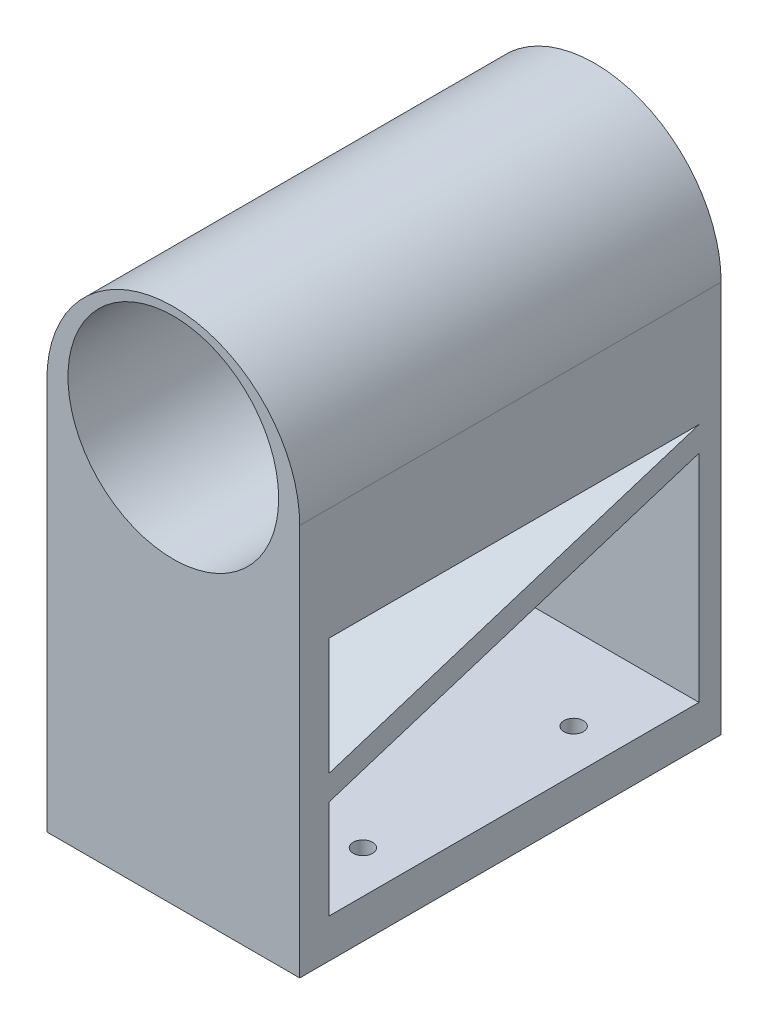
ISO-10303-21;
HEADER;
FILE_DESCRIPTION(('STEP AP214'),'2;1');
FILE_NAME('part.step','',(''),(''),'','','');
FILE_SCHEMA(('AUTOMOTIVE_DESIGN { 1 0 10303 214 1 1 1 1 }'));
ENDSEC;
DATA;
#1=APPLICATION_CONTEXT('core data for automotive mechanical design processes');
#2=APPLICATION_PROTOCOL_DEFINITION('international standard','automotive_design',2000,#1);
#3=PRODUCT_CONTEXT('',#1,'mechanical');
#4=PRODUCT('Part','Part','',(#3));
#5=PRODUCT_RELATED_PRODUCT_CATEGORY('part','',(#4));
#6=PRODUCT_DEFINITION_FORMATION('','',#4);
#7=PRODUCT_DEFINITION_CONTEXT('part definition',#1,'design');
#8=PRODUCT_DEFINITION('design','',#6,#7);
#9=PRODUCT_DEFINITION_SHAPE('','',#8);
#10=(LENGTH_UNIT() NAMED_UNIT(*) SI_UNIT(.MILLI.,.METRE.));
#11=(NAMED_UNIT(*) PLANE_ANGLE_UNIT() SI_UNIT($,.RADIAN.));
#12=(NAMED_UNIT(*) SI_UNIT($,.STERADIAN.) SOLID_ANGLE_UNIT());
#13=UNCERTAINTY_MEASURE_WITH_UNIT(LENGTH_MEASURE(1.E-05),#10,'distance_accuracy_value','');
#14=(GEOMETRIC_REPRESENTATION_CONTEXT(3) GLOBAL_UNCERTAINTY_ASSIGNED_CONTEXT((#13)) GLOBAL_UNIT_ASSIGNED_CONTEXT((#10,
#11,#12)) REPRESENTATION_CONTEXT('',''));
#15=CARTESIAN_POINT('',(0.,0.,0.));
#16=DIRECTION('',(0.,0.,1.));
#17=DIRECTION('',(1.,0.,0.));
#18=AXIS2_PLACEMENT_3D('',#15,#16,#17);
#19=CARTESIAN_POINT('',(-12.7,16.9848695652174,50.8));
#20=DIRECTION('',(1.,0.,0.));
#21=DIRECTION('',(0.,1.,0.));
#22=AXIS2_PLACEMENT_3D('',#19,#20,#21);
#23=PLANE('',#22);
#24=DIRECTION('',(0.,-0.30176042441697,0.953383787493626));
#25=VECTOR('',#24,1.);
#26=CARTESIAN_POINT('',(-12.7,-11.8783950754035,41.6643391021884));
#27=LINE('',#26,#25);
#28=CARTESIAN_POINT('',(-12.7,0.46563063998659,2.66454642826376));
#29=VERTEX_POINT('',#28);
#30=CARTESIAN_POINT('',(-12.7,-13.6454059569076,47.2470444221642));
#31=VERTEX_POINT('',#30);
#32=EDGE_CURVE('E198',#29,#31,#27,.T.);
#33=ORIENTED_EDGE('',*,*,#32,.T.);
#34=DIRECTION('',(0.,-1.,0.));
#35=VECTOR('',#34,1.);
#36=CARTESIAN_POINT('',(-12.7,16.9848695652174,47.2470444221642));
#37=LINE('',#36,#35);
#38=CARTESIAN_POINT('',(-12.7,-25.5538829775332,47.2470444221642));
#39=VERTEX_POINT('',#38);
#40=EDGE_CURVE('E202',#31,#39,#37,.T.);
#41=ORIENTED_EDGE('',*,*,#40,.T.);
#42=DIRECTION('',(0.,0.,-1.));
#43=VECTOR('',#42,1.);
#44=CARTESIAN_POINT('',(-12.7,-25.5538829775333,50.8));
#45=LINE('',#44,#43);
#46=CARTESIAN_POINT('',(-12.7,-25.5538829775333,2.66454642826376));
#47=VERTEX_POINT('',#46);
#48=EDGE_CURVE('E193',#39,#47,#45,.T.);
#49=ORIENTED_EDGE('',*,*,#48,.T.);
#50=DIRECTION('',(0.,1.,0.));
#51=VECTOR('',#50,1.);
#52=CARTESIAN_POINT('',(-12.7,16.9848695652174,2.66454642826376));
#53=LINE('',#52,#51);
#54=EDGE_CURVE('E129',#47,#29,#53,.T.);
#55=ORIENTED_EDGE('',*,*,#54,.T.);
#56=EDGE_LOOP('',(#33,#41,#49,#55));
#57=FACE_BOUND('',#56,.T.);
#58=DIRECTION('',(0.,0.,1.));
#59=VECTOR('',#58,1.);
#60=CARTESIAN_POINT('',(-12.7,3.45371440236873,50.8));
#61=LINE('',#60,#59);
#62=CARTESIAN_POINT('',(-12.7,3.45371440236873,2.66454642826376));
#63=VERTEX_POINT('',#62);
#64=CARTESIAN_POINT('',(-12.7,3.45371440236873,47.2470444221642));
#65=VERTEX_POINT('',#64);
#66=EDGE_CURVE('E185',#63,#65,#61,.T.);
#67=ORIENTED_EDGE('',*,*,#66,.T.);
#68=DIRECTION('',(0.,-1.,0.));
#69=VECTOR('',#68,1.);
#70=CARTESIAN_POINT('',(-12.7,16.9848695652174,47.2470444221642));
#71=LINE('',#70,#69);
#72=CARTESIAN_POINT('',(-12.7,-10.6573221945254,47.2470444221642));
#73=VERTEX_POINT('',#72);
#74=EDGE_CURVE('E189',#65,#73,#71,.T.);
#75=ORIENTED_EDGE('',*,*,#74,.T.);
#76=DIRECTION('',(0.,0.30176042441697,-0.953383787493626));
#77=VECTOR('',#76,1.);
#78=CARTESIAN_POINT('',(-12.7,-9.16240428935774,42.5239913671638));
#79=LINE('',#78,#77);
#80=EDGE_CURVE('E176',#73,#63,#79,.T.);
#81=ORIENTED_EDGE('',*,*,#80,.T.);
#82=EDGE_LOOP('',(#67,#75,#81));
#83=FACE_BOUND('',#82,.T.);
#84=DIRECTION('',(0.,-1.,0.));
#85=VECTOR('',#84,1.);
#86=CARTESIAN_POINT('',(-12.7,16.9848695652174,0.));
#87=LINE('',#86,#85);
#88=CARTESIAN_POINT('',(-12.7,16.9848695652174,0.));
#89=VERTEX_POINT('',#88);
#90=CARTESIAN_POINT('',(-12.7,-30.2591304347826,0.));
#91=VERTEX_POINT('',#90);
#92=EDGE_CURVE('E211',#89,#91,#87,.T.);
#93=ORIENTED_EDGE('',*,*,#92,.T.);
#94=DIRECTION('',(0.,0.,-1.));
#95=VECTOR('',#94,1.);
#96=CARTESIAN_POINT('',(-12.7,-30.2591304347826,50.8));
#97=LINE('',#96,#95);
#98=CARTESIAN_POINT('',(-12.7,-30.2591304347826,50.8));
#99=VERTEX_POINT('',#98);
#100=EDGE_CURVE('E11',#99,#91,#97,.T.);
#101=ORIENTED_EDGE('',*,*,#100,.F.);
#102=DIRECTION('',(0.,-1.,0.));
#103=VECTOR('',#102,1.);
#104=CARTESIAN_POINT('',(-12.7,16.9848695652174,50.8));
#105=LINE('',#104,#103);
#106=CARTESIAN_POINT('',(-12.7,16.9848695652174,50.8));
#107=VERTEX_POINT('',#106);
#108=EDGE_CURVE('E215',#107,#99,#105,.T.);
#109=ORIENTED_EDGE('',*,*,#108,.F.);
#110=DIRECTION('',(0.,0.,-1.));
#111=VECTOR('',#110,1.);
#112=CARTESIAN_POINT('',(-12.7,16.9848695652174,50.8));
#113=LINE('',#112,#111);
#114=EDGE_CURVE('E229',#107,#89,#113,.T.);
#115=ORIENTED_EDGE('',*,*,#114,.T.);
#116=EDGE_LOOP('',(#93,#101,#109,#115));
#117=FACE_BOUND('',#116,.T.);
#118=ADVANCED_FACE('F39',(#57,#83,#117),#23,.F.);
#119=CARTESIAN_POINT('',(17.78,-30.2591304347826,50.8));
#120=DIRECTION('',(0.,1.,0.));
#121=DIRECTION('',(0.,0.,1.));
#122=AXIS2_PLACEMENT_3D('',#119,#120,#121);
#123=PLANE('',#122);
#124=CARTESIAN_POINT('',(12.7,-30.2591304347826,12.7));
#125=DIRECTION('',(0.,-1.,0.));
#126=DIRECTION('',(0.,0.,-1.));
#127=AXIS2_PLACEMENT_3D('',#124,#125,#126);
#128=CIRCLE('',#127,1.16674744552587);
#129=CARTESIAN_POINT('',(12.7,-30.2591304347826,11.5332525544741));
#130=VERTEX_POINT('',#129);
#131=EDGE_CURVE('E275',#130,#130,#128,.T.);
#132=ORIENTED_EDGE('',*,*,#131,.F.);
#133=EDGE_LOOP('',(#132));
#134=FACE_BOUND('',#133,.T.);
#135=CARTESIAN_POINT('',(12.7,-30.2591304347826,38.1));
#136=DIRECTION('',(0.,-1.,0.));
#137=DIRECTION('',(0.,0.,-1.));
#138=AXIS2_PLACEMENT_3D('',#135,#136,#137);
#139=CIRCLE('',#138,1.16674744552587);
#140=CARTESIAN_POINT('',(12.7,-30.2591304347826,36.9332525544741));
#141=VERTEX_POINT('',#140);
#142=EDGE_CURVE('E279',#141,#141,#139,.T.);
#143=ORIENTED_EDGE('',*,*,#142,.F.);
#144=EDGE_LOOP('',(#143));
#145=FACE_BOUND('',#144,.T.);
#146=CARTESIAN_POINT('',(-7.62000000000001,-30.2591304347826,38.1));
#147=DIRECTION('',(0.,-1.,0.));
#148=DIRECTION('',(0.,0.,-1.));
#149=AXIS2_PLACEMENT_3D('',#146,#147,#148);
#150=CIRCLE('',#149,1.16674744552587);
#151=CARTESIAN_POINT('',(-7.62000000000001,-30.2591304347826,36.9332525544741));
#152=VERTEX_POINT('',#151);
#153=EDGE_CURVE('E274',#152,#152,#150,.T.);
#154=ORIENTED_EDGE('',*,*,#153,.F.);
#155=EDGE_LOOP('',(#154));
#156=FACE_BOUND('',#155,.T.);
#157=CARTESIAN_POINT('',(-7.62,-30.2591304347826,12.7));
#158=DIRECTION('',(0.,-1.,0.));
#159=DIRECTION('',(0.,0.,-1.));
#160=AXIS2_PLACEMENT_3D('',#157,#158,#159);
#161=CIRCLE('',#160,1.16674744552587);
#162=CARTESIAN_POINT('',(-7.62,-30.2591304347826,11.5332525544741));
#163=VERTEX_POINT('',#162);
#164=EDGE_CURVE('E256',#163,#163,#161,.T.);
#165=ORIENTED_EDGE('',*,*,#164,.F.);
#166=EDGE_LOOP('',(#165));
#167=FACE_BOUND('',#166,.T.);
#168=DIRECTION('',(1.,0.,0.));
#169=VECTOR('',#168,1.);
#170=CARTESIAN_POINT('',(17.78,-30.2591304347826,0.));
#171=LINE('',#170,#169);
#172=CARTESIAN_POINT('',(17.78,-30.2591304347826,0.));
#173=VERTEX_POINT('',#172);
#174=EDGE_CURVE('E233',#91,#173,#171,.T.);
#175=ORIENTED_EDGE('',*,*,#174,.T.);
#176=DIRECTION('',(0.,0.,-1.));
#177=VECTOR('',#176,1.);
#178=CARTESIAN_POINT('',(17.78,-30.2591304347826,50.8));
#179=LINE('',#178,#177);
#180=CARTESIAN_POINT('',(17.78,-30.2591304347826,50.8));
#181=VERTEX_POINT('',#180);
#182=EDGE_CURVE('E48',#181,#173,#179,.T.);
#183=ORIENTED_EDGE('',*,*,#182,.F.);
#184=DIRECTION('',(1.,0.,0.));
#185=VECTOR('',#184,1.);
#186=CARTESIAN_POINT('',(17.78,-30.2591304347826,50.8));
#187=LINE('',#186,#185);
#188=EDGE_CURVE('E219',#99,#181,#187,.T.);
#189=ORIENTED_EDGE('',*,*,#188,.F.);
#190=ORIENTED_EDGE('',*,*,#100,.T.);
#191=EDGE_LOOP('',(#175,#183,#189,#190));
#192=FACE_BOUND('',#191,.T.);
#193=ADVANCED_FACE('F290',(#134,#145,#156,#167,#192),#123,.F.);
#194=CARTESIAN_POINT('',(17.78,16.9848695652174,50.8));
#195=DIRECTION('',(-1.,0.,0.));
#196=DIRECTION('',(0.,-1.,0.));
#197=AXIS2_PLACEMENT_3D('',#194,#195,#196);
#198=PLANE('',#197);
#199=DIRECTION('',(0.,0.,-1.));
#200=VECTOR('',#199,1.);
#201=CARTESIAN_POINT('',(17.78,-25.5538829775332,2.66454642826376));
#202=LINE('',#201,#200);
#203=CARTESIAN_POINT('',(17.78,-25.5538829775332,47.2470444221642));
#204=VERTEX_POINT('',#203);
#205=CARTESIAN_POINT('',(17.78,-25.5538829775332,2.66454642826376));
#206=VERTEX_POINT('',#205);
#207=EDGE_CURVE('E137',#204,#206,#202,.T.);
#208=ORIENTED_EDGE('',*,*,#207,.F.);
#209=DIRECTION('',(0.,-1.,0.));
#210=VECTOR('',#209,1.);
#211=CARTESIAN_POINT('',(17.78,-25.5538829775332,47.2470444221642));
#212=LINE('',#211,#210);
#213=CARTESIAN_POINT('',(17.78,-13.6454059569075,47.2470444221642));
#214=VERTEX_POINT('',#213);
#215=EDGE_CURVE('E143',#214,#204,#212,.T.);
#216=ORIENTED_EDGE('',*,*,#215,.F.);
#217=DIRECTION('',(0.,-0.30176042441697,0.953383787493626));
#218=VECTOR('',#217,1.);
#219=CARTESIAN_POINT('',(17.78,-13.6454059569075,47.2470444221642));
#220=LINE('',#219,#218);
#221=CARTESIAN_POINT('',(17.78,0.465630639986594,2.66454642826376));
#222=VERTEX_POINT('',#221);
#223=EDGE_CURVE('E148',#222,#214,#220,.T.);
#224=ORIENTED_EDGE('',*,*,#223,.F.);
#225=DIRECTION('',(0.,1.,0.));
#226=VECTOR('',#225,1.);
#227=CARTESIAN_POINT('',(17.78,0.465630639986594,2.66454642826376));
#228=LINE('',#227,#226);
#229=EDGE_CURVE('E126',#206,#222,#228,.T.);
#230=ORIENTED_EDGE('',*,*,#229,.F.);
#231=EDGE_LOOP('',(#208,#216,#224,#230));
#232=FACE_BOUND('',#231,.T.);
#233=DIRECTION('',(0.,0.30176042441697,-0.953383787493626));
#234=VECTOR('',#233,1.);
#235=CARTESIAN_POINT('',(17.78,3.45371440236873,2.66454642826376));
#236=LINE('',#235,#234);
#237=CARTESIAN_POINT('',(17.78,-10.6573221945254,47.2470444221642));
#238=VERTEX_POINT('',#237);
#239=CARTESIAN_POINT('',(17.78,3.45371440236873,2.66454642826376));
#240=VERTEX_POINT('',#239);
#241=EDGE_CURVE('E165',#238,#240,#236,.T.);
#242=ORIENTED_EDGE('',*,*,#241,.F.);
#243=DIRECTION('',(0.,-1.,0.));
#244=VECTOR('',#243,1.);
#245=CARTESIAN_POINT('',(17.78,-10.6573221945254,47.2470444221642));
#246=LINE('',#245,#244);
#247=CARTESIAN_POINT('',(17.78,3.45371440236873,47.2470444221642));
#248=VERTEX_POINT('',#247);
#249=EDGE_CURVE('E158',#248,#238,#246,.T.);
#250=ORIENTED_EDGE('',*,*,#249,.F.);
#251=DIRECTION('',(0.,0.,1.));
#252=VECTOR('',#251,1.);
#253=CARTESIAN_POINT('',(17.78,3.45371440236873,47.2470444221642));
#254=LINE('',#253,#252);
#255=EDGE_CURVE('E168',#240,#248,#254,.T.);
#256=ORIENTED_EDGE('',*,*,#255,.F.);
#257=EDGE_LOOP('',(#242,#250,#256));
#258=FACE_BOUND('',#257,.T.);
#259=DIRECTION('',(0.,1.,0.));
#260=VECTOR('',#259,1.);
#261=CARTESIAN_POINT('',(17.78,16.9848695652174,0.));
#262=LINE('',#261,#260);
#263=CARTESIAN_POINT('',(17.78,16.9848695652174,0.));
#264=VERTEX_POINT('',#263);
#265=EDGE_CURVE('E236',#173,#264,#262,.T.);
#266=ORIENTED_EDGE('',*,*,#265,.T.);
#267=DIRECTION('',(0.,0.,-1.));
#268=VECTOR('',#267,1.);
#269=CARTESIAN_POINT('',(17.78,16.9848695652174,50.8));
#270=LINE('',#269,#268);
#271=CARTESIAN_POINT('',(17.78,16.9848695652174,50.8));
#272=VERTEX_POINT('',#271);
#273=EDGE_CURVE('E244',#272,#264,#270,.T.);
#274=ORIENTED_EDGE('',*,*,#273,.F.);
#275=DIRECTION('',(0.,1.,0.));
#276=VECTOR('',#275,1.);
#277=CARTESIAN_POINT('',(17.78,16.9848695652174,50.8));
#278=LINE('',#277,#276);
#279=EDGE_CURVE('E223',#181,#272,#278,.T.);
#280=ORIENTED_EDGE('',*,*,#279,.F.);
#281=ORIENTED_EDGE('',*,*,#182,.T.);
#282=EDGE_LOOP('',(#266,#274,#280,#281));
#283=FACE_BOUND('',#282,.T.);
#284=ADVANCED_FACE('F145',(#232,#258,#283),#198,.F.);
#285=CARTESIAN_POINT('',(2.53999999999999,16.9848695652174,50.8));
#286=DIRECTION('',(0.,0.,-1.));
#287=DIRECTION('',(-1.,0.,0.));
#288=AXIS2_PLACEMENT_3D('',#285,#286,#287);
#289=CYLINDRICAL_SURFACE('',#288,15.24);
#290=CARTESIAN_POINT('',(2.53999999999999,16.9848695652174,0.));
#291=DIRECTION('',(0.,0.,1.));
#292=DIRECTION('',(1.,0.,0.));
#293=AXIS2_PLACEMENT_3D('',#290,#291,#292);
#294=CIRCLE('',#293,15.24);
#295=EDGE_CURVE('E220',#264,#89,#294,.T.);
#296=ORIENTED_EDGE('',*,*,#295,.T.);
#297=ORIENTED_EDGE('',*,*,#114,.F.);
#298=CARTESIAN_POINT('',(2.53999999999999,16.9848695652174,50.8));
#299=DIRECTION('',(0.,0.,1.));
#300=DIRECTION('',(1.,0.,0.));
#301=AXIS2_PLACEMENT_3D('',#298,#299,#300);
#302=CIRCLE('',#301,15.24);
#303=EDGE_CURVE('E226',#272,#107,#302,.T.);
#304=ORIENTED_EDGE('',*,*,#303,.F.);
#305=ORIENTED_EDGE('',*,*,#273,.T.);
#306=EDGE_LOOP('',(#296,#297,#304,#305));
#307=FACE_BOUND('',#306,.T.);
#308=ADVANCED_FACE('F308',(#307),#289,.T.);
#309=CARTESIAN_POINT('',(2.53999999999999,16.9848695652174,50.8));
#310=DIRECTION('',(0.,0.,1.));
#311=DIRECTION('',(1.,0.,0.));
#312=AXIS2_PLACEMENT_3D('',#309,#310,#311);
#313=PLANE('',#312);
#314=CARTESIAN_POINT('',(2.53999999999999,18.5426141499505,50.8));
#315=DIRECTION('',(0.,0.,1.));
#316=DIRECTION('',(1.,0.,0.));
#317=AXIS2_PLACEMENT_3D('',#314,#315,#316);
#318=CIRCLE('',#317,12.7);
#319=CARTESIAN_POINT('',(15.24,18.5426141499505,50.8));
#320=VERTEX_POINT('',#319);
#321=EDGE_CURVE('E206',#320,#320,#318,.T.);
#322=ORIENTED_EDGE('',*,*,#321,.F.);
#323=EDGE_LOOP('',(#322));
#324=FACE_BOUND('',#323,.T.);
#325=ORIENTED_EDGE('',*,*,#108,.T.);
#326=ORIENTED_EDGE('',*,*,#188,.T.);
#327=ORIENTED_EDGE('',*,*,#279,.T.);
#328=ORIENTED_EDGE('',*,*,#303,.T.);
#329=EDGE_LOOP('',(#325,#326,#327,#328));
#330=FACE_BOUND('',#329,.T.);
#331=ADVANCED_FACE('F313',(#324,#330),#313,.T.);
#332=CARTESIAN_POINT('',(2.53999999999999,16.9848695652174,0.));
#333=DIRECTION('',(0.,0.,1.));
#334=DIRECTION('',(1.,0.,0.));
#335=AXIS2_PLACEMENT_3D('',#332,#333,#334);
#336=PLANE('',#335);
#337=CARTESIAN_POINT('',(2.53999999999999,18.5426141499505,0.));
#338=DIRECTION('',(0.,0.,1.));
#339=DIRECTION('',(1.,0.,0.));
#340=AXIS2_PLACEMENT_3D('',#337,#338,#339);
#341=CIRCLE('',#340,12.7);
#342=CARTESIAN_POINT('',(15.24,18.5426141499505,0.));
#343=VERTEX_POINT('',#342);
#344=EDGE_CURVE('E207',#343,#343,#341,.T.);
#345=ORIENTED_EDGE('',*,*,#344,.T.);
#346=EDGE_LOOP('',(#345));
#347=FACE_BOUND('',#346,.T.);
#348=ORIENTED_EDGE('',*,*,#92,.F.);
#349=ORIENTED_EDGE('',*,*,#295,.F.);
#350=ORIENTED_EDGE('',*,*,#265,.F.);
#351=ORIENTED_EDGE('',*,*,#174,.F.);
#352=EDGE_LOOP('',(#348,#349,#350,#351));
#353=FACE_BOUND('',#352,.T.);
#354=ADVANCED_FACE('F305',(#347,#353),#336,.F.);
#355=CARTESIAN_POINT('',(2.53999999999999,18.5426141499505,0.));
#356=DIRECTION('',(0.,0.,1.));
#357=DIRECTION('',(1.,0.,0.));
#358=AXIS2_PLACEMENT_3D('',#355,#356,#357);
#359=CYLINDRICAL_SURFACE('',#358,12.7);
#360=ORIENTED_EDGE('',*,*,#344,.F.);
#361=EDGE_LOOP('',(#360));
#362=FACE_BOUND('',#361,.T.);
#363=ORIENTED_EDGE('',*,*,#321,.T.);
#364=EDGE_LOOP('',(#363));
#365=FACE_BOUND('',#364,.T.);
#366=ADVANCED_FACE('F321',(#362,#365),#359,.F.);
#367=CARTESIAN_POINT('',(-33.02,-10.6573221945254,47.2470444221642));
#368=DIRECTION('',(0.,0.,1.));
#369=DIRECTION('',(1.,0.,0.));
#370=AXIS2_PLACEMENT_3D('',#367,#368,#369);
#371=PLANE('',#370);
#372=DIRECTION('',(1.,0.,0.));
#373=VECTOR('',#372,1.);
#374=CARTESIAN_POINT('',(-33.02,3.45371440236873,47.2470444221642));
#375=LINE('',#374,#373);
#376=EDGE_CURVE('E173',#65,#248,#375,.T.);
#377=ORIENTED_EDGE('',*,*,#376,.T.);
#378=ORIENTED_EDGE('',*,*,#249,.T.);
#379=DIRECTION('',(1.,0.,0.));
#380=VECTOR('',#379,1.);
#381=CARTESIAN_POINT('',(-33.02,-10.6573221945254,47.2470444221642));
#382=LINE('',#381,#380);
#383=EDGE_CURVE('E172',#73,#238,#382,.T.);
#384=ORIENTED_EDGE('',*,*,#383,.F.);
#385=ORIENTED_EDGE('',*,*,#74,.F.);
#386=EDGE_LOOP('',(#377,#378,#384,#385));
#387=FACE_BOUND('',#386,.T.);
#388=ADVANCED_FACE('F338',(#387),#371,.F.);
#389=CARTESIAN_POINT('',(-33.02,3.45371440236873,47.2470444221642));
#390=DIRECTION('',(0.,1.,0.));
#391=DIRECTION('',(-1.,0.,0.));
#392=AXIS2_PLACEMENT_3D('',#389,#390,#391);
#393=PLANE('',#392);
#394=DIRECTION('',(1.,0.,0.));
#395=VECTOR('',#394,1.);
#396=CARTESIAN_POINT('',(-33.02,3.45371440236872,2.66454642826376));
#397=LINE('',#396,#395);
#398=EDGE_CURVE('E64',#63,#240,#397,.T.);
#399=ORIENTED_EDGE('',*,*,#398,.T.);
#400=ORIENTED_EDGE('',*,*,#255,.T.);
#401=ORIENTED_EDGE('',*,*,#376,.F.);
#402=ORIENTED_EDGE('',*,*,#66,.F.);
#403=EDGE_LOOP('',(#399,#400,#401,#402));
#404=FACE_BOUND('',#403,.T.);
#405=ADVANCED_FACE('F334',(#404),#393,.F.);
#406=CARTESIAN_POINT('',(-33.02,3.45371440236872,2.66454642826376));
#407=DIRECTION('',(0.,-0.953383787493625,-0.30176042441697));
#408=DIRECTION('',(0.,0.30176042441697,-0.953383787493626));
#409=AXIS2_PLACEMENT_3D('',#406,#407,#408);
#410=PLANE('',#409);
#411=ORIENTED_EDGE('',*,*,#383,.T.);
#412=ORIENTED_EDGE('',*,*,#241,.T.);
#413=ORIENTED_EDGE('',*,*,#398,.F.);
#414=ORIENTED_EDGE('',*,*,#80,.F.);
#415=EDGE_LOOP('',(#411,#412,#413,#414));
#416=FACE_BOUND('',#415,.T.);
#417=ADVANCED_FACE('F341',(#416),#410,.F.);
#418=CARTESIAN_POINT('',(-33.02,-25.5538829775333,47.2470444221642));
#419=DIRECTION('',(0.,0.,1.));
#420=DIRECTION('',(1.,0.,0.));
#421=AXIS2_PLACEMENT_3D('',#418,#419,#420);
#422=PLANE('',#421);
#423=DIRECTION('',(1.,0.,0.));
#424=VECTOR('',#423,1.);
#425=CARTESIAN_POINT('',(-33.02,-13.6454059569076,47.2470444221642));
#426=LINE('',#425,#424);
#427=EDGE_CURVE('E155',#31,#214,#426,.T.);
#428=ORIENTED_EDGE('',*,*,#427,.T.);
#429=ORIENTED_EDGE('',*,*,#215,.T.);
#430=DIRECTION('',(1.,0.,0.));
#431=VECTOR('',#430,1.);
#432=CARTESIAN_POINT('',(-33.02,-25.5538829775333,47.2470444221642));
#433=LINE('',#432,#431);
#434=EDGE_CURVE('E133',#39,#204,#433,.T.);
#435=ORIENTED_EDGE('',*,*,#434,.F.);
#436=ORIENTED_EDGE('',*,*,#40,.F.);
#437=EDGE_LOOP('',(#428,#429,#435,#436));
#438=FACE_BOUND('',#437,.T.);
#439=ADVANCED_FACE('F443',(#438),#422,.F.);
#440=CARTESIAN_POINT('',(-33.02,-13.6454059569076,47.2470444221642));
#441=DIRECTION('',(0.,0.953383787493625,0.30176042441697));
#442=DIRECTION('',(0.,-0.30176042441697,0.953383787493626));
#443=AXIS2_PLACEMENT_3D('',#440,#441,#442);
#444=PLANE('',#443);
#445=DIRECTION('',(1.,0.,0.));
#446=VECTOR('',#445,1.);
#447=CARTESIAN_POINT('',(-33.02,0.465630639986587,2.66454642826376));
#448=LINE('',#447,#446);
#449=EDGE_CURVE('E132',#29,#222,#448,.T.);
#450=ORIENTED_EDGE('',*,*,#449,.T.);
#451=ORIENTED_EDGE('',*,*,#223,.T.);
#452=ORIENTED_EDGE('',*,*,#427,.F.);
#453=ORIENTED_EDGE('',*,*,#32,.F.);
#454=EDGE_LOOP('',(#450,#451,#452,#453));
#455=FACE_BOUND('',#454,.T.);
#456=ADVANCED_FACE('F440',(#455),#444,.F.);
#457=CARTESIAN_POINT('',(-33.02,0.465630639986587,2.66454642826376));
#458=DIRECTION('',(0.,0.,-1.));
#459=DIRECTION('',(-1.,0.,0.));
#460=AXIS2_PLACEMENT_3D('',#457,#458,#459);
#461=PLANE('',#460);
#462=DIRECTION('',(1.,0.,0.));
#463=VECTOR('',#462,1.);
#464=CARTESIAN_POINT('',(-33.02,-25.5538829775333,2.66454642826376));
#465=LINE('',#464,#463);
#466=EDGE_CURVE('E56',#47,#206,#465,.T.);
#467=ORIENTED_EDGE('',*,*,#466,.T.);
#468=ORIENTED_EDGE('',*,*,#229,.T.);
#469=ORIENTED_EDGE('',*,*,#449,.F.);
#470=ORIENTED_EDGE('',*,*,#54,.F.);
#471=EDGE_LOOP('',(#467,#468,#469,#470));
#472=FACE_BOUND('',#471,.T.);
#473=ADVANCED_FACE('F123',(#472),#461,.F.);
#474=CARTESIAN_POINT('',(-33.02,-25.5538829775333,2.66454642826376));
#475=DIRECTION('',(0.,-1.,0.));
#476=DIRECTION('',(1.,0.,0.));
#477=AXIS2_PLACEMENT_3D('',#474,#475,#476);
#478=PLANE('',#477);
#479=CARTESIAN_POINT('',(12.7,-25.5538829775332,12.7));
#480=DIRECTION('',(0.,-1.,0.));
#481=DIRECTION('',(1.,0.,0.));
#482=AXIS2_PLACEMENT_3D('',#479,#480,#481);
#483=CIRCLE('',#482,1.16674744552587);
#484=CARTESIAN_POINT('',(13.8667474455259,-25.5538829775332,12.7));
#485=VERTEX_POINT('',#484);
#486=EDGE_CURVE('E42',#485,#485,#483,.T.);
#487=ORIENTED_EDGE('',*,*,#486,.T.);
#488=EDGE_LOOP('',(#487));
#489=FACE_BOUND('',#488,.T.);
#490=CARTESIAN_POINT('',(12.7,-25.5538829775332,38.1));
#491=DIRECTION('',(0.,-1.,0.));
#492=DIRECTION('',(1.,0.,0.));
#493=AXIS2_PLACEMENT_3D('',#490,#491,#492);
#494=CIRCLE('',#493,1.16674744552587);
#495=CARTESIAN_POINT('',(13.8667474455259,-25.5538829775332,38.1));
#496=VERTEX_POINT('',#495);
#497=EDGE_CURVE('E259',#496,#496,#494,.T.);
#498=ORIENTED_EDGE('',*,*,#497,.T.);
#499=EDGE_LOOP('',(#498));
#500=FACE_BOUND('',#499,.T.);
#501=CARTESIAN_POINT('',(-7.62000000000001,-25.5538829775332,38.1));
#502=DIRECTION('',(0.,-1.,0.));
#503=DIRECTION('',(1.,0.,0.));
#504=AXIS2_PLACEMENT_3D('',#501,#502,#503);
#505=CIRCLE('',#504,1.16674744552587);
#506=CARTESIAN_POINT('',(-6.45325255447414,-25.5538829775332,38.1));
#507=VERTEX_POINT('',#506);
#508=EDGE_CURVE('E255',#507,#507,#505,.T.);
#509=ORIENTED_EDGE('',*,*,#508,.T.);
#510=EDGE_LOOP('',(#509));
#511=FACE_BOUND('',#510,.T.);
#512=CARTESIAN_POINT('',(-7.62,-25.5538829775332,12.7));
#513=DIRECTION('',(0.,-1.,0.));
#514=DIRECTION('',(1.,0.,0.));
#515=AXIS2_PLACEMENT_3D('',#512,#513,#514);
#516=CIRCLE('',#515,1.16674744552587);
#517=CARTESIAN_POINT('',(-6.45325255447413,-25.5538829775332,12.7));
#518=VERTEX_POINT('',#517);
#519=EDGE_CURVE('E251',#518,#518,#516,.T.);
#520=ORIENTED_EDGE('',*,*,#519,.T.);
#521=EDGE_LOOP('',(#520));
#522=FACE_BOUND('',#521,.T.);
#523=ORIENTED_EDGE('',*,*,#434,.T.);
#524=ORIENTED_EDGE('',*,*,#207,.T.);
#525=ORIENTED_EDGE('',*,*,#466,.F.);
#526=ORIENTED_EDGE('',*,*,#48,.F.);
#527=EDGE_LOOP('',(#523,#524,#525,#526));
#528=FACE_BOUND('',#527,.T.);
#529=ADVANCED_FACE('F138',(#489,#500,#511,#522,#528),#478,.F.);
#530=CARTESIAN_POINT('',(-7.62,-22.6391304347826,12.7));
#531=DIRECTION('',(0.,-1.,0.));
#532=DIRECTION('',(0.,0.,-1.));
#533=AXIS2_PLACEMENT_3D('',#530,#531,#532);
#534=CYLINDRICAL_SURFACE('',#533,1.16674744552587);
#535=ORIENTED_EDGE('',*,*,#164,.T.);
#536=EDGE_LOOP('',(#535));
#537=FACE_BOUND('',#536,.T.);
#538=ORIENTED_EDGE('',*,*,#519,.F.);
#539=EDGE_LOOP('',(#538));
#540=FACE_BOUND('',#539,.T.);
#541=ADVANCED_FACE('F397',(#537,#540),#534,.F.);
#542=CARTESIAN_POINT('',(-7.62000000000001,-22.6391304347826,38.1));
#543=DIRECTION('',(0.,-1.,0.));
#544=DIRECTION('',(0.,0.,-1.));
#545=AXIS2_PLACEMENT_3D('',#542,#543,#544);
#546=CYLINDRICAL_SURFACE('',#545,1.16674744552587);
#547=ORIENTED_EDGE('',*,*,#153,.T.);
#548=EDGE_LOOP('',(#547));
#549=FACE_BOUND('',#548,.T.);
#550=ORIENTED_EDGE('',*,*,#508,.F.);
#551=EDGE_LOOP('',(#550));
#552=FACE_BOUND('',#551,.T.);
#553=ADVANCED_FACE('F287',(#549,#552),#546,.F.);
#554=CARTESIAN_POINT('',(12.7,-22.6391304347826,38.1));
#555=DIRECTION('',(0.,-1.,0.));
#556=DIRECTION('',(0.,0.,-1.));
#557=AXIS2_PLACEMENT_3D('',#554,#555,#556);
#558=CYLINDRICAL_SURFACE('',#557,1.16674744552587);
#559=ORIENTED_EDGE('',*,*,#142,.T.);
#560=EDGE_LOOP('',(#559));
#561=FACE_BOUND('',#560,.T.);
#562=ORIENTED_EDGE('',*,*,#497,.F.);
#563=EDGE_LOOP('',(#562));
#564=FACE_BOUND('',#563,.T.);
#565=ADVANCED_FACE('F415',(#561,#564),#558,.F.);
#566=CARTESIAN_POINT('',(12.7,-22.6391304347826,12.7));
#567=DIRECTION('',(0.,-1.,0.));
#568=DIRECTION('',(0.,0.,-1.));
#569=AXIS2_PLACEMENT_3D('',#566,#567,#568);
#570=CYLINDRICAL_SURFACE('',#569,1.16674744552587);
#571=ORIENTED_EDGE('',*,*,#131,.T.);
#572=EDGE_LOOP('',(#571));
#573=FACE_BOUND('',#572,.T.);
#574=ORIENTED_EDGE('',*,*,#486,.F.);
#575=EDGE_LOOP('',(#574));
#576=FACE_BOUND('',#575,.T.);
#577=ADVANCED_FACE('F424',(#573,#576),#570,.F.);
#578=CLOSED_SHELL('',(#118,#193,#284,#308,#331,#354,#366,#388,#405,#417,#439,#456,#473,#529,
#541,#553,#565,#577));
#579=MANIFOLD_SOLID_BREP('B2',#578);
#580=ADVANCED_BREP_SHAPE_REPRESENTATION('',(#18,#579),#14);
#581=SHAPE_DEFINITION_REPRESENTATION(#9,#580);
ENDSEC;
END-ISO-10303-21;
